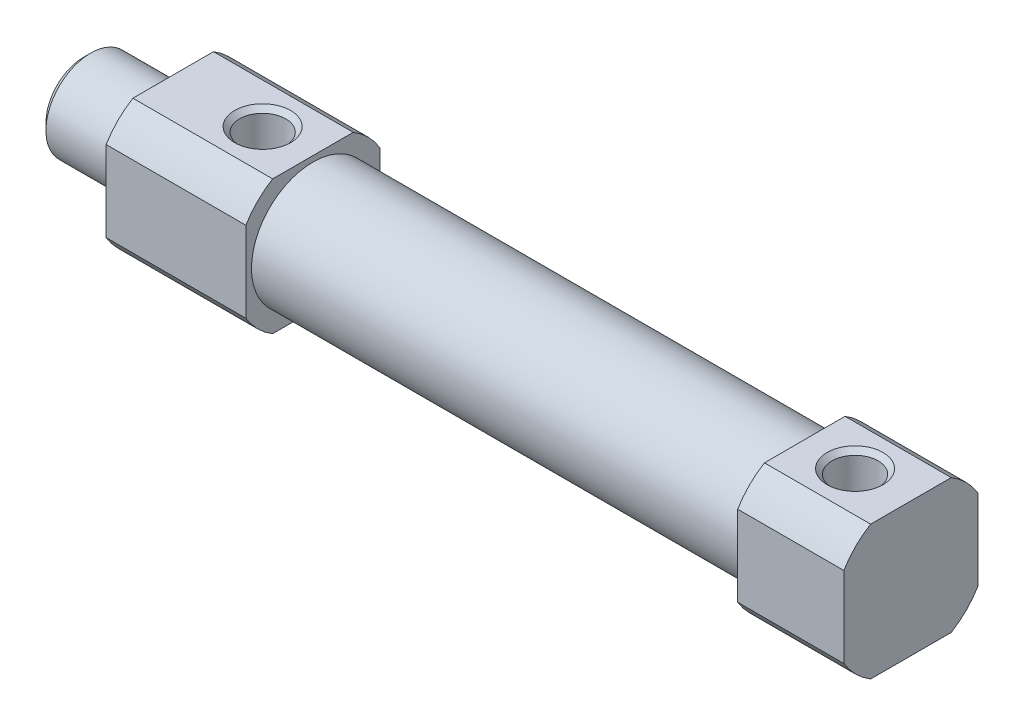
ISO-10303-21;
HEADER;
FILE_DESCRIPTION(('STEP AP214'),'2;1');
FILE_NAME('part.step','',(''),(''),'','','');
FILE_SCHEMA(('AUTOMOTIVE_DESIGN { 1 0 10303 214 1 1 1 1 }'));
ENDSEC;
DATA;
#1=APPLICATION_CONTEXT('core data for automotive mechanical design processes');
#2=APPLICATION_PROTOCOL_DEFINITION('international standard','automotive_design',2000,#1);
#3=PRODUCT_CONTEXT('',#1,'mechanical');
#4=PRODUCT('Part','Part','',(#3));
#5=PRODUCT_RELATED_PRODUCT_CATEGORY('part','',(#4));
#6=PRODUCT_DEFINITION_FORMATION('','',#4);
#7=PRODUCT_DEFINITION_CONTEXT('part definition',#1,'design');
#8=PRODUCT_DEFINITION('design','',#6,#7);
#9=PRODUCT_DEFINITION_SHAPE('','',#8);
#10=(LENGTH_UNIT() NAMED_UNIT(*) SI_UNIT(.MILLI.,.METRE.));
#11=(NAMED_UNIT(*) PLANE_ANGLE_UNIT() SI_UNIT($,.RADIAN.));
#12=(NAMED_UNIT(*) SI_UNIT($,.STERADIAN.) SOLID_ANGLE_UNIT());
#13=UNCERTAINTY_MEASURE_WITH_UNIT(LENGTH_MEASURE(1.E-05),#10,'distance_accuracy_value','');
#14=(GEOMETRIC_REPRESENTATION_CONTEXT(3) GLOBAL_UNCERTAINTY_ASSIGNED_CONTEXT((#13)) GLOBAL_UNIT_ASSIGNED_CONTEXT((#10,
#11,#12)) REPRESENTATION_CONTEXT('',''));
#15=CARTESIAN_POINT('',(0.,0.,0.));
#16=DIRECTION('',(0.,0.,1.));
#17=DIRECTION('',(1.,0.,0.));
#18=AXIS2_PLACEMENT_3D('',#15,#16,#17);
#19=CARTESIAN_POINT('',(8.,6.,0.));
#20=DIRECTION('',(0.,-1.,0.));
#21=DIRECTION('',(0.,0.,1.));
#22=AXIS2_PLACEMENT_3D('',#19,#20,#21);
#23=CYLINDRICAL_SURFACE('',#22,2.067);
#24=CARTESIAN_POINT('',(8.,5.567,0.));
#25=DIRECTION('',(0.,1.,0.));
#26=DIRECTION('',(0.,0.,1.));
#27=AXIS2_PLACEMENT_3D('',#24,#25,#26);
#28=CIRCLE('',#27,2.067);
#29=CARTESIAN_POINT('',(8.,5.567,2.067));
#30=VERTEX_POINT('',#29);
#31=EDGE_CURVE('E247',#30,#30,#28,.T.);
#32=ORIENTED_EDGE('',*,*,#31,.T.);
#33=EDGE_LOOP('',(#32));
#34=FACE_BOUND('',#33,.T.);
#35=CARTESIAN_POINT('',(8.,0.5,0.));
#36=DIRECTION('',(0.,1.,0.));
#37=DIRECTION('',(0.,0.,1.));
#38=AXIS2_PLACEMENT_3D('',#35,#36,#37);
#39=CIRCLE('',#38,2.067);
#40=CARTESIAN_POINT('',(8.7228340058409,0.5,-1.93649167310371));
#41=VERTEX_POINT('',#40);
#42=CARTESIAN_POINT('',(7.2771659941591,0.5,-1.93649167310371));
#43=VERTEX_POINT('',#42);
#44=EDGE_CURVE('E246',#41,#43,#39,.T.);
#45=ORIENTED_EDGE('',*,*,#44,.F.);
#46=CARTESIAN_POINT('',(8.7228340058409,0.5,1.93649167310371));
#47=CARTESIAN_POINT('',(8.74641438669346,0.534015946439016,1.92769864732704));
#48=CARTESIAN_POINT('',(8.77066364385471,0.567342883395501,1.91814791375889));
#49=CARTESIAN_POINT('',(8.82005444410187,0.632835445308381,1.8975528045644));
#50=CARTESIAN_POINT('',(8.84519562088774,0.665001536307264,1.88650903698835));
#51=CARTESIAN_POINT('',(8.92133047181884,0.760137906072527,1.85115392646312));
#52=CARTESIAN_POINT('',(8.97302457510778,0.821731334468729,1.8246227082621));
#53=CARTESIAN_POINT('',(9.07699051726692,0.942526469905346,1.7652790597632));
#54=CARTESIAN_POINT('',(9.1292628873707,1.00169750050937,1.73240552185181));
#55=CARTESIAN_POINT('',(9.23274225869917,1.11705503609938,1.66036439219352));
#56=CARTESIAN_POINT('',(9.28394956599672,1.17324240593131,1.62119863770975));
#57=CARTESIAN_POINT('',(9.37300061379834,1.27000415812177,1.54594420537475));
#58=CARTESIAN_POINT('',(9.41124350632402,1.31123169742145,1.51116882391587));
#59=CARTESIAN_POINT('',(9.48611139402732,1.39149089629071,1.43760898815819));
#60=CARTESIAN_POINT('',(9.52273645076092,1.43052263942221,1.39882468658007));
#61=CARTESIAN_POINT('',(9.62927512494374,1.54359636931833,1.27655390438046));
#62=CARTESIAN_POINT('',(9.69621979492033,1.61401287784804,1.18684800095903));
#63=CARTESIAN_POINT('',(9.80246811368708,1.72528159444406,1.01541633972738));
#64=CARTESIAN_POINT('',(9.84449607743109,1.76912200778013,0.937314133860419));
#65=CARTESIAN_POINT('',(9.91945270072035,1.847140483146,0.772260551749924));
#66=CARTESIAN_POINT('',(9.95238267305496,1.88131993921443,0.685310454687801));
#67=CARTESIAN_POINT('',(10.007069128276,1.9380127992167,0.503259282744631));
#68=CARTESIAN_POINT('',(10.0287151226791,1.96041086268032,0.408087868522303));
#69=CARTESIAN_POINT('',(10.0582963189668,1.99100743013652,0.213437325577024));
#70=CARTESIAN_POINT('',(10.066248072675,1.9992230760263,0.113963546355035));
#71=CARTESIAN_POINT('',(10.0675455565534,2.0005636687613,-0.0701170944974319));
#72=CARTESIAN_POINT('',(10.0629110273649,1.99577537721693,-0.1547062908428));
#73=CARTESIAN_POINT('',(10.0435752982495,1.97578274801866,-0.321451306875911));
#74=CARTESIAN_POINT('',(10.0288735483919,1.96057784134806,-0.403606993375277));
#75=CARTESIAN_POINT('',(9.99087501310422,1.92122876202926,-0.561577101355674));
#76=CARTESIAN_POINT('',(9.96777541614164,1.89728963337458,-0.637491556045158));
#77=CARTESIAN_POINT('',(9.91426683119609,1.84173376999063,-0.783671346792084));
#78=CARTESIAN_POINT('',(9.88385566373221,1.8101147459589,-0.853934990068616));
#79=CARTESIAN_POINT('',(9.80152100698764,1.72429749568737,-1.019340338323));
#80=CARTESIAN_POINT('',(9.74616613620386,1.66643292592594,-1.11088037424613));
#81=CARTESIAN_POINT('',(9.62635147533628,1.5404220715695,-1.27995238682515));
#82=CARTESIAN_POINT('',(9.56186582838299,1.47224654933571,-1.35744310573905));
#83=CARTESIAN_POINT('',(9.40217450637081,1.30186673298192,-1.52451203486714));
#84=CARTESIAN_POINT('',(9.30434117568644,1.19631889983385,-1.60819466234155));
#85=CARTESIAN_POINT('',(9.15439659308825,1.02990219743606,-1.71570727863333));
#86=CARTESIAN_POINT('',(9.10388139766241,0.973079359869926,-1.74854349546478));
#87=CARTESIAN_POINT('',(9.00270525296404,0.856606760726646,-1.80845646199698));
#88=CARTESIAN_POINT('',(8.9520444063416,0.796958673709608,-1.83553657244434));
#89=CARTESIAN_POINT('',(8.87119067120393,0.697833563230635,-1.87475010954378));
#90=CARTESIAN_POINT('',(8.84058732683454,0.659377098882475,-1.88863658871653));
#91=CARTESIAN_POINT('',(8.78062663814254,0.580936928190525,-1.91420724305179));
#92=CARTESIAN_POINT('',(8.75126684973025,0.54095654199685,-1.92589590982073));
#93=CARTESIAN_POINT('',(8.7228340058409,0.500000000000001,-1.93649167310371));
#94=B_SPLINE_CURVE_WITH_KNOTS('',3,(#46,#47,#48,#49,#50,#51,#52,#53,#54,#55,#56,#57,#58,#59,#60,
#61,#62,#63,#64,#65,#66,#67,#68,#69,#70,#71,#72,#73,#74,#75,#76,#77,#78,#79,#80,#81,#82,#83,#84,
#85,#86,#87,#88,#89,#90,#91,#92,#93),.UNSPECIFIED.,.F.,.F.,(4,2,2,2,2,2,2,2,2,2,2,2,2,2,2,2,2,2,
2,2,2,2,2,4),(0.,0.126886662620257,0.253721804412297,0.50744860829703,0.763754566782337,
1.01998582210413,1.21816387660203,1.41633438424443,1.8108370863841,2.10658615336432,
2.40229252309111,2.70084238668585,2.99903114797452,3.25230237318273,3.50558743465593,
3.7532733154639,4.00103311984414,4.36386157394748,4.72773884935274,5.22429885238841,
5.47259063968532,5.72073705929309,5.87387882412701,6.02670413247603),.UNSPECIFIED.);
#95=CARTESIAN_POINT('',(8.7228340058409,0.5,1.93649167310371));
#96=VERTEX_POINT('',#95);
#97=EDGE_CURVE('E224',#96,#41,#94,.T.);
#98=ORIENTED_EDGE('',*,*,#97,.F.);
#99=CARTESIAN_POINT('',(7.2771659941591,0.500000000000001,1.93649167310371));
#100=VERTEX_POINT('',#99);
#101=EDGE_CURVE('E244',#100,#96,#39,.T.);
#102=ORIENTED_EDGE('',*,*,#101,.F.);
#103=CARTESIAN_POINT('',(7.2771659941591,0.5,-1.93649167310371));
#104=CARTESIAN_POINT('',(7.25358561330654,0.534015946439015,-1.92769864732704));
#105=CARTESIAN_POINT('',(7.2293363561453,0.5673428833955,-1.91814791375889));
#106=CARTESIAN_POINT('',(7.17994555589813,0.63283544530838,-1.89755280456441));
#107=CARTESIAN_POINT('',(7.15480437911226,0.665001536307263,-1.88650903698835));
#108=CARTESIAN_POINT('',(7.07866952818116,0.760137906072526,-1.85115392646312));
#109=CARTESIAN_POINT('',(7.02697542489222,0.821731334468729,-1.8246227082621));
#110=CARTESIAN_POINT('',(6.92300948273308,0.942526469905346,-1.7652790597632));
#111=CARTESIAN_POINT('',(6.8707371126293,1.00169750050937,-1.73240552185182));
#112=CARTESIAN_POINT('',(6.76725774130083,1.11705503609938,-1.66036439219352));
#113=CARTESIAN_POINT('',(6.71605043400328,1.17324240593131,-1.62119863770975));
#114=CARTESIAN_POINT('',(6.62699938620166,1.27000415812177,-1.54594420537475));
#115=CARTESIAN_POINT('',(6.58875649367598,1.31123169742145,-1.51116882391587));
#116=CARTESIAN_POINT('',(6.51388860597268,1.39149089629071,-1.43760898815819));
#117=CARTESIAN_POINT('',(6.47726354923908,1.43052263942221,-1.39882468658007));
#118=CARTESIAN_POINT('',(6.37072487505626,1.54359636931833,-1.27655390438046));
#119=CARTESIAN_POINT('',(6.30378020507967,1.61401287784804,-1.18684800095903));
#120=CARTESIAN_POINT('',(6.19753188631292,1.72528159444406,-1.01541633972738));
#121=CARTESIAN_POINT('',(6.15550392256891,1.76912200778013,-0.937314133860419));
#122=CARTESIAN_POINT('',(6.08054729927965,1.847140483146,-0.772260551749924));
#123=CARTESIAN_POINT('',(6.04761732694504,1.88131993921443,-0.685310454687801));
#124=CARTESIAN_POINT('',(5.99293087172402,1.9380127992167,-0.503259282744631));
#125=CARTESIAN_POINT('',(5.97128487732094,1.96041086268032,-0.408087868522303));
#126=CARTESIAN_POINT('',(5.94170368103322,1.99100743013652,-0.213437325577024));
#127=CARTESIAN_POINT('',(5.93375192732501,1.9992230760263,-0.113963546355034));
#128=CARTESIAN_POINT('',(5.93245444344663,2.0005636687613,0.0701170944974332));
#129=CARTESIAN_POINT('',(5.93708897263512,1.99577537721694,0.154706290842801));
#130=CARTESIAN_POINT('',(5.95642470175051,1.97578274801866,0.321451306875912));
#131=CARTESIAN_POINT('',(5.97112645160811,1.96057784134806,0.403606993375278));
#132=CARTESIAN_POINT('',(6.00912498689579,1.92122876202926,0.561577101355675));
#133=CARTESIAN_POINT('',(6.03222458385836,1.89728963337458,0.637491556045159));
#134=CARTESIAN_POINT('',(6.08573316880391,1.84173376999063,0.783671346792085));
#135=CARTESIAN_POINT('',(6.11614433626778,1.8101147459589,0.853934990068617));
#136=CARTESIAN_POINT('',(6.19847899301236,1.72429749568737,1.019340338323));
#137=CARTESIAN_POINT('',(6.25383386379614,1.66643292592594,1.11088037424613));
#138=CARTESIAN_POINT('',(6.37364852466372,1.5404220715695,1.27995238682515));
#139=CARTESIAN_POINT('',(6.43813417161701,1.47224654933571,1.35744310573905));
#140=CARTESIAN_POINT('',(6.59782549362919,1.30186673298192,1.52451203486714));
#141=CARTESIAN_POINT('',(6.69565882431356,1.19631889983385,1.60819466234155));
#142=CARTESIAN_POINT('',(6.84560340691175,1.02990219743606,1.71570727863333));
#143=CARTESIAN_POINT('',(6.89611860233759,0.973079359869925,1.74854349546478));
#144=CARTESIAN_POINT('',(6.99729474703596,0.856606760726645,1.80845646199698));
#145=CARTESIAN_POINT('',(7.0479555936584,0.796958673709609,1.83553657244434));
#146=CARTESIAN_POINT('',(7.12880932879607,0.697833563230635,1.87475010954378));
#147=CARTESIAN_POINT('',(7.15941267316546,0.659377098882475,1.88863658871653));
#148=CARTESIAN_POINT('',(7.21937336185746,0.580936928190524,1.91420724305179));
#149=CARTESIAN_POINT('',(7.24873315026975,0.540956541996849,1.92589590982073));
#150=CARTESIAN_POINT('',(7.2771659941591,0.500000000000001,1.93649167310371));
#151=B_SPLINE_CURVE_WITH_KNOTS('',3,(#103,#104,#105,#106,#107,#108,#109,#110,#111,#112,#113,
#114,#115,#116,#117,#118,#119,#120,#121,#122,#123,#124,#125,#126,#127,#128,#129,#130,#131,#132,
#133,#134,#135,#136,#137,#138,#139,#140,#141,#142,#143,#144,#145,#146,#147,#148,#149,#150),
.UNSPECIFIED.,.F.,.F.,(4,2,2,2,2,2,2,2,2,2,2,2,2,2,2,2,2,2,2,2,2,2,2,4),(0.,0.126886662620256,
0.253721804412296,0.507448608297029,0.763754566782338,1.01998582210413,1.21816387660203,
1.41633438424443,1.8108370863841,2.10658615336432,2.40229252309111,2.70084238668585,
2.99903114797452,3.25230237318273,3.50558743465594,3.7532733154639,4.00103311984414,
4.36386157394748,4.72773884935274,5.22429885238841,5.47259063968532,5.72073705929309,
5.87387882412701,6.02670413247603),.UNSPECIFIED.);
#152=EDGE_CURVE('E230',#43,#100,#151,.T.);
#153=ORIENTED_EDGE('',*,*,#152,.F.);
#154=EDGE_LOOP('',(#45,#98,#102,#153));
#155=FACE_BOUND('',#154,.T.);
#156=ADVANCED_FACE('F41',(#34,#155),#23,.F.);
#157=CARTESIAN_POINT('',(8.,0.5,0.));
#158=DIRECTION('',(0.,1.,0.));
#159=DIRECTION('',(0.,0.,-1.));
#160=AXIS2_PLACEMENT_3D('',#157,#158,#159);
#161=CONICAL_SURFACE('',#160,2.067,1.0471975511966);
#162=ORIENTED_EDGE('',*,*,#44,.T.);
#163=CARTESIAN_POINT('',(9.24704241368537,0.619538300641497,-1.90162359420529));
#164=CARTESIAN_POINT('',(9.1229247075013,0.585577610865678,-1.91268265466528));
#165=CARTESIAN_POINT('',(8.99756248643156,0.554821201104464,-1.92169201637551));
#166=CARTESIAN_POINT('',(8.74445887332115,0.502262996770411,-1.93610179290636));
#167=CARTESIAN_POINT('',(8.61671217144973,0.480484541566679,-1.94149282394494));
#168=CARTESIAN_POINT('',(8.3631103855628,0.449066378855434,-1.94900005347991));
#169=CARTESIAN_POINT('',(8.23729908516125,0.439111049117393,-1.95120176378268));
#170=CARTESIAN_POINT('',(7.9854527873799,0.431787902042918,-1.95283909097587));
#171=CARTESIAN_POINT('',(7.85941838765312,0.434401667114269,-1.95227875508386));
#172=CARTESIAN_POINT('',(7.65152971872454,0.448741725634538,-1.94901329499722));
#173=CARTESIAN_POINT('',(7.5694009342667,0.457021688340908,-1.9471128235577));
#174=CARTESIAN_POINT('',(7.40574290856366,0.478251250868833,-1.94200848228045));
#175=CARTESIAN_POINT('',(7.32421405052357,0.491203608818529,-1.93880384244494));
#176=CARTESIAN_POINT('',(7.16046360825313,0.521394482936852,-1.93090481591668));
#177=CARTESIAN_POINT('',(7.07825752374738,0.538708530328618,-1.92618372424274));
#178=CARTESIAN_POINT('',(6.91486222357032,0.576746379129997,-1.91513900885633));
#179=CARTESIAN_POINT('',(6.8336717631633,0.597465450813619,-1.90881760156029));
#180=CARTESIAN_POINT('',(6.75295758631464,0.619538300641506,-1.90162359420531));
#181=B_SPLINE_CURVE_WITH_KNOTS('',3,(#163,#164,#165,#166,#167,#168,#169,#170,#171,#172,#173,
#174,#175,#176,#177,#178,#179,#180),.UNSPECIFIED.,.F.,.F.,(4,2,2,2,2,2,2,2,4),(0.,
0.387678442983826,0.776358446332346,1.15441095381005,1.53190966695773,1.77946861072623,
2.02717392901579,2.27950543246196,2.53148935390974),.UNSPECIFIED.);
#182=EDGE_CURVE('E11',#41,#43,#181,.T.);
#183=ORIENTED_EDGE('',*,*,#182,.F.);
#184=EDGE_LOOP('',(#162,#183));
#185=FACE_BOUND('',#184,.T.);
#186=ADVANCED_FACE('F206',(#185),#161,.F.);
#187=ORIENTED_EDGE('',*,*,#101,.T.);
#188=CARTESIAN_POINT('',(6.75295758631463,0.619538300641497,1.90162359420529));
#189=CARTESIAN_POINT('',(6.8770752924987,0.585577610865677,1.91268265466528));
#190=CARTESIAN_POINT('',(7.00243751356845,0.554821201104463,1.92169201637551));
#191=CARTESIAN_POINT('',(7.25554112667885,0.50226299677041,1.93610179290636));
#192=CARTESIAN_POINT('',(7.38328782855027,0.480484541566679,1.94149282394494));
#193=CARTESIAN_POINT('',(7.6368896144372,0.449066378855434,1.94900005347991));
#194=CARTESIAN_POINT('',(7.76270091483874,0.439111049117393,1.95120176378268));
#195=CARTESIAN_POINT('',(8.0145472126201,0.431787902042918,1.95283909097587));
#196=CARTESIAN_POINT('',(8.14058161234688,0.434401667114269,1.95227875508386));
#197=CARTESIAN_POINT('',(8.34847028127546,0.448741725634538,1.94901329499722));
#198=CARTESIAN_POINT('',(8.4305990657333,0.457021688340908,1.9471128235577));
#199=CARTESIAN_POINT('',(8.59425709143634,0.478251250868833,1.94200848228045));
#200=CARTESIAN_POINT('',(8.67578594947643,0.491203608818529,1.93880384244494));
#201=CARTESIAN_POINT('',(8.83953639174687,0.521394482936852,1.93090481591668));
#202=CARTESIAN_POINT('',(8.92174247625262,0.538708530328618,1.92618372424274));
#203=CARTESIAN_POINT('',(9.08513777642968,0.576746379129998,1.91513900885633));
#204=CARTESIAN_POINT('',(9.1663282368367,0.59746545081362,1.90881760156029));
#205=CARTESIAN_POINT('',(9.24704241368537,0.619538300641506,1.90162359420531));
#206=B_SPLINE_CURVE_WITH_KNOTS('',3,(#188,#189,#190,#191,#192,#193,#194,#195,#196,#197,#198,
#199,#200,#201,#202,#203,#204,#205),.UNSPECIFIED.,.F.,.F.,(4,2,2,2,2,2,2,2,4),(0.,
0.387678442983827,0.776358446332345,1.15441095381004,1.53190966695772,1.77946861072623,
2.02717392901578,2.27950543246196,2.53148935390974),.UNSPECIFIED.);
#207=EDGE_CURVE('E54',#100,#96,#206,.T.);
#208=ORIENTED_EDGE('',*,*,#207,.F.);
#209=EDGE_LOOP('',(#187,#208));
#210=FACE_BOUND('',#209,.T.);
#211=ADVANCED_FACE('F211',(#210),#161,.F.);
#212=CARTESIAN_POINT('',(-8.,0.,0.));
#213=DIRECTION('',(1.,0.,0.));
#214=DIRECTION('',(0.,0.,1.));
#215=AXIS2_PLACEMENT_3D('',#212,#213,#214);
#216=PLANE('',#215);
#217=CARTESIAN_POINT('',(-8.,0.,0.));
#218=DIRECTION('',(1.,0.,0.));
#219=DIRECTION('',(0.,0.,-1.));
#220=AXIS2_PLACEMENT_3D('',#217,#218,#219);
#221=CIRCLE('',#220,2.);
#222=CARTESIAN_POINT('',(-8.,0.,-2.));
#223=VERTEX_POINT('',#222);
#224=EDGE_CURVE('E511',#223,#223,#221,.T.);
#225=ORIENTED_EDGE('',*,*,#224,.T.);
#226=EDGE_LOOP('',(#225));
#227=FACE_BOUND('',#226,.T.);
#228=CARTESIAN_POINT('',(-8.,0.,0.));
#229=DIRECTION('',(1.,0.,0.));
#230=DIRECTION('',(0.,0.,-1.));
#231=AXIS2_PLACEMENT_3D('',#228,#229,#230);
#232=CIRCLE('',#231,3.3865);
#233=CARTESIAN_POINT('',(-8.,0.,-3.3865));
#234=VERTEX_POINT('',#233);
#235=EDGE_CURVE('E196',#234,#234,#232,.T.);
#236=ORIENTED_EDGE('',*,*,#235,.F.);
#237=EDGE_LOOP('',(#236));
#238=FACE_BOUND('',#237,.T.);
#239=ADVANCED_FACE('F43',(#227,#238),#216,.F.);
#240=CARTESIAN_POINT('',(-7.3865,0.,0.));
#241=DIRECTION('',(1.,0.,0.));
#242=DIRECTION('',(0.,0.,1.));
#243=AXIS2_PLACEMENT_3D('',#240,#241,#242);
#244=CONICAL_SURFACE('',#243,4.,0.785398163397448);
#245=ORIENTED_EDGE('',*,*,#235,.T.);
#246=EDGE_LOOP('',(#245));
#247=FACE_BOUND('',#246,.T.);
#248=CARTESIAN_POINT('',(-7.3865,0.,0.));
#249=DIRECTION('',(1.,0.,0.));
#250=DIRECTION('',(0.,0.,-1.));
#251=AXIS2_PLACEMENT_3D('',#248,#249,#250);
#252=CIRCLE('',#251,4.);
#253=CARTESIAN_POINT('',(-7.3865,0.,-4.));
#254=VERTEX_POINT('',#253);
#255=EDGE_CURVE('E193',#254,#254,#252,.T.);
#256=ORIENTED_EDGE('',*,*,#255,.F.);
#257=EDGE_LOOP('',(#256));
#258=FACE_BOUND('',#257,.T.);
#259=ADVANCED_FACE('F379',(#247,#258),#244,.T.);
#260=CARTESIAN_POINT('',(0.,0.,0.));
#261=DIRECTION('',(-1.,0.,0.));
#262=DIRECTION('',(0.,0.,-1.));
#263=AXIS2_PLACEMENT_3D('',#260,#261,#262);
#264=CYLINDRICAL_SURFACE('',#263,4.);
#265=ORIENTED_EDGE('',*,*,#255,.T.);
#266=EDGE_LOOP('',(#265));
#267=FACE_BOUND('',#266,.T.);
#268=CARTESIAN_POINT('',(0.,0.,0.));
#269=DIRECTION('',(1.,0.,0.));
#270=DIRECTION('',(0.,0.,-1.));
#271=AXIS2_PLACEMENT_3D('',#268,#269,#270);
#272=CIRCLE('',#271,4.);
#273=CARTESIAN_POINT('',(0.,0.,-4.));
#274=VERTEX_POINT('',#273);
#275=EDGE_CURVE('E190',#274,#274,#272,.T.);
#276=ORIENTED_EDGE('',*,*,#275,.F.);
#277=EDGE_LOOP('',(#276));
#278=FACE_BOUND('',#277,.T.);
#279=ADVANCED_FACE('F377',(#267,#278),#264,.T.);
#280=CARTESIAN_POINT('',(12.5,1.2195106036117E-12,1.2195106036117E-12));
#281=DIRECTION('',(-1.,0.,0.));
#282=DIRECTION('',(0.,0.,-1.));
#283=AXIS2_PLACEMENT_3D('',#280,#281,#282);
#284=CYLINDRICAL_SURFACE('',#283,7.00000000000001);
#285=CARTESIAN_POINT('',(0.,1.2195106036117E-12,1.2195106036117E-12));
#286=DIRECTION('',(-1.,0.,0.));
#287=DIRECTION('',(0.,0.,1.));
#288=AXIS2_PLACEMENT_3D('',#285,#286,#287);
#289=CIRCLE('',#288,7.00000000000001);
#290=CARTESIAN_POINT('',(0.,6.,-3.605551275464));
#291=VERTEX_POINT('',#290);
#292=CARTESIAN_POINT('',(0.,3.605551275464,-6.));
#293=VERTEX_POINT('',#292);
#294=EDGE_CURVE('E155',#291,#293,#289,.T.);
#295=ORIENTED_EDGE('',*,*,#294,.F.);
#296=DIRECTION('',(-1.,0.,0.));
#297=VECTOR('',#296,1.);
#298=CARTESIAN_POINT('',(12.5,6.,-3.605551275464));
#299=LINE('',#298,#297);
#300=CARTESIAN_POINT('',(12.5,6.,-3.605551275464));
#301=VERTEX_POINT('',#300);
#302=EDGE_CURVE('E154',#301,#291,#299,.T.);
#303=ORIENTED_EDGE('',*,*,#302,.F.);
#304=CARTESIAN_POINT('',(12.5,1.2195106036117E-12,1.2195106036117E-12));
#305=DIRECTION('',(-1.,0.,0.));
#306=DIRECTION('',(0.,0.,1.));
#307=AXIS2_PLACEMENT_3D('',#304,#305,#306);
#308=CIRCLE('',#307,7.00000000000001);
#309=CARTESIAN_POINT('',(12.5,3.605551275464,-6.));
#310=VERTEX_POINT('',#309);
#311=EDGE_CURVE('E174',#301,#310,#308,.T.);
#312=ORIENTED_EDGE('',*,*,#311,.T.);
#313=DIRECTION('',(-1.,0.,0.));
#314=VECTOR('',#313,1.);
#315=CARTESIAN_POINT('',(12.5,3.605551275464,-6.));
#316=LINE('',#315,#314);
#317=EDGE_CURVE('E187',#310,#293,#316,.T.);
#318=ORIENTED_EDGE('',*,*,#317,.T.);
#319=EDGE_LOOP('',(#295,#303,#312,#318));
#320=FACE_BOUND('',#319,.T.);
#321=ADVANCED_FACE('F350',(#320),#284,.T.);
#322=CARTESIAN_POINT('',(12.5,3.605551275464,-6.));
#323=DIRECTION('',(0.,0.,1.));
#324=DIRECTION('',(-1.,0.,0.));
#325=AXIS2_PLACEMENT_3D('',#322,#323,#324);
#326=PLANE('',#325);
#327=DIRECTION('',(0.,-1.,0.));
#328=VECTOR('',#327,1.);
#329=CARTESIAN_POINT('',(0.,3.605551275464,-6.));
#330=LINE('',#329,#328);
#331=CARTESIAN_POINT('',(0.,-3.605551275464,-6.));
#332=VERTEX_POINT('',#331);
#333=EDGE_CURVE('E157',#293,#332,#330,.T.);
#334=ORIENTED_EDGE('',*,*,#333,.F.);
#335=ORIENTED_EDGE('',*,*,#317,.F.);
#336=DIRECTION('',(0.,-1.,0.));
#337=VECTOR('',#336,1.);
#338=CARTESIAN_POINT('',(12.5,3.605551275464,-6.));
#339=LINE('',#338,#337);
#340=CARTESIAN_POINT('',(12.5,-3.605551275464,-6.));
#341=VERTEX_POINT('',#340);
#342=EDGE_CURVE('E109',#310,#341,#339,.T.);
#343=ORIENTED_EDGE('',*,*,#342,.T.);
#344=DIRECTION('',(-1.,0.,0.));
#345=VECTOR('',#344,1.);
#346=CARTESIAN_POINT('',(12.5,-3.605551275464,-6.));
#347=LINE('',#346,#345);
#348=EDGE_CURVE('E184',#341,#332,#347,.T.);
#349=ORIENTED_EDGE('',*,*,#348,.T.);
#350=EDGE_LOOP('',(#334,#335,#343,#349));
#351=FACE_BOUND('',#350,.T.);
#352=ADVANCED_FACE('F346',(#351),#326,.F.);
#353=CARTESIAN_POINT('',(12.5,1.2195106036117E-12,1.2195106036117E-12));
#354=DIRECTION('',(-1.,0.,0.));
#355=DIRECTION('',(0.,0.,-1.));
#356=AXIS2_PLACEMENT_3D('',#353,#354,#355);
#357=CYLINDRICAL_SURFACE('',#356,7.00000000000168);
#358=CARTESIAN_POINT('',(0.,1.2195106036117E-12,1.2195106036117E-12));
#359=DIRECTION('',(-1.,0.,0.));
#360=DIRECTION('',(0.,0.,1.));
#361=AXIS2_PLACEMENT_3D('',#358,#359,#360);
#362=CIRCLE('',#361,7.00000000000168);
#363=CARTESIAN_POINT('',(0.,-6.,-3.605551275464));
#364=VERTEX_POINT('',#363);
#365=EDGE_CURVE('E161',#332,#364,#362,.T.);
#366=ORIENTED_EDGE('',*,*,#365,.F.);
#367=ORIENTED_EDGE('',*,*,#348,.F.);
#368=CARTESIAN_POINT('',(12.5,1.2195106036117E-12,1.2195106036117E-12));
#369=DIRECTION('',(-1.,0.,0.));
#370=DIRECTION('',(0.,0.,1.));
#371=AXIS2_PLACEMENT_3D('',#368,#369,#370);
#372=CIRCLE('',#371,7.00000000000168);
#373=CARTESIAN_POINT('',(12.5,-6.,-3.605551275464));
#374=VERTEX_POINT('',#373);
#375=EDGE_CURVE('E332',#341,#374,#372,.T.);
#376=ORIENTED_EDGE('',*,*,#375,.T.);
#377=DIRECTION('',(-1.,0.,0.));
#378=VECTOR('',#377,1.);
#379=CARTESIAN_POINT('',(12.5,-6.,-3.605551275464));
#380=LINE('',#379,#378);
#381=EDGE_CURVE('E181',#374,#364,#380,.T.);
#382=ORIENTED_EDGE('',*,*,#381,.T.);
#383=EDGE_LOOP('',(#366,#367,#376,#382));
#384=FACE_BOUND('',#383,.T.);
#385=ADVANCED_FACE('F344',(#384),#357,.T.);
#386=CARTESIAN_POINT('',(12.5,-6.,-3.605551275464));
#387=DIRECTION('',(0.,1.,0.));
#388=DIRECTION('',(0.,0.,-1.));
#389=AXIS2_PLACEMENT_3D('',#386,#387,#388);
#390=PLANE('',#389);
#391=DIRECTION('',(0.,0.,1.));
#392=VECTOR('',#391,1.);
#393=CARTESIAN_POINT('',(0.,-6.,-3.605551275464));
#394=LINE('',#393,#392);
#395=CARTESIAN_POINT('',(0.,-6.,3.605551275464));
#396=VERTEX_POINT('',#395);
#397=EDGE_CURVE('E164',#364,#396,#394,.T.);
#398=ORIENTED_EDGE('',*,*,#397,.F.);
#399=ORIENTED_EDGE('',*,*,#381,.F.);
#400=DIRECTION('',(0.,0.,1.));
#401=VECTOR('',#400,1.);
#402=CARTESIAN_POINT('',(12.5,-6.,-3.605551275464));
#403=LINE('',#402,#401);
#404=CARTESIAN_POINT('',(12.5,-6.,3.605551275464));
#405=VERTEX_POINT('',#404);
#406=EDGE_CURVE('E149',#374,#405,#403,.T.);
#407=ORIENTED_EDGE('',*,*,#406,.T.);
#408=DIRECTION('',(-1.,0.,0.));
#409=VECTOR('',#408,1.);
#410=CARTESIAN_POINT('',(12.5,-6.,3.605551275464));
#411=LINE('',#410,#409);
#412=EDGE_CURVE('E178',#405,#396,#411,.T.);
#413=ORIENTED_EDGE('',*,*,#412,.T.);
#414=EDGE_LOOP('',(#398,#399,#407,#413));
#415=FACE_BOUND('',#414,.T.);
#416=ADVANCED_FACE('F337',(#415),#390,.F.);
#417=CARTESIAN_POINT('',(12.5,1.2195106036117E-12,1.2195106036117E-12));
#418=DIRECTION('',(-1.,0.,0.));
#419=DIRECTION('',(0.,0.,-1.));
#420=AXIS2_PLACEMENT_3D('',#417,#418,#419);
#421=CYLINDRICAL_SURFACE('',#420,7.00000000000001);
#422=CARTESIAN_POINT('',(0.,1.2195106036117E-12,1.2195106036117E-12));
#423=DIRECTION('',(-1.,0.,0.));
#424=DIRECTION('',(0.,0.,1.));
#425=AXIS2_PLACEMENT_3D('',#422,#423,#424);
#426=CIRCLE('',#425,7.00000000000001);
#427=CARTESIAN_POINT('',(0.,-3.60555127546422,6.00000000000036));
#428=VERTEX_POINT('',#427);
#429=EDGE_CURVE('E167',#396,#428,#426,.T.);
#430=ORIENTED_EDGE('',*,*,#429,.F.);
#431=ORIENTED_EDGE('',*,*,#412,.F.);
#432=CARTESIAN_POINT('',(12.5,1.2195106036117E-12,1.2195106036117E-12));
#433=DIRECTION('',(-1.,0.,0.));
#434=DIRECTION('',(0.,0.,1.));
#435=AXIS2_PLACEMENT_3D('',#432,#433,#434);
#436=CIRCLE('',#435,7.00000000000001);
#437=CARTESIAN_POINT('',(12.5,-3.60555127546422,6.00000000000036));
#438=VERTEX_POINT('',#437);
#439=EDGE_CURVE('E147',#405,#438,#436,.T.);
#440=ORIENTED_EDGE('',*,*,#439,.T.);
#441=DIRECTION('',(-1.,0.,0.));
#442=VECTOR('',#441,1.);
#443=CARTESIAN_POINT('',(12.5,-3.60555127546422,6.00000000000036));
#444=LINE('',#443,#442);
#445=EDGE_CURVE('E141',#438,#428,#444,.T.);
#446=ORIENTED_EDGE('',*,*,#445,.T.);
#447=EDGE_LOOP('',(#430,#431,#440,#446));
#448=FACE_BOUND('',#447,.T.);
#449=ADVANCED_FACE('F341',(#448),#421,.T.);
#450=CARTESIAN_POINT('',(12.5,-3.605551275464,6.));
#451=DIRECTION('',(0.,0.,-1.));
#452=DIRECTION('',(1.,0.,0.));
#453=AXIS2_PLACEMENT_3D('',#450,#451,#452);
#454=PLANE('',#453);
#455=DIRECTION('',(0.,1.,0.));
#456=VECTOR('',#455,1.);
#457=CARTESIAN_POINT('',(0.,-3.605551275464,6.));
#458=LINE('',#457,#456);
#459=CARTESIAN_POINT('',(0.,3.605551275464,6.));
#460=VERTEX_POINT('',#459);
#461=EDGE_CURVE('E170',#428,#460,#458,.T.);
#462=ORIENTED_EDGE('',*,*,#461,.F.);
#463=ORIENTED_EDGE('',*,*,#445,.F.);
#464=DIRECTION('',(0.,1.,0.));
#465=VECTOR('',#464,1.);
#466=CARTESIAN_POINT('',(12.5,-3.605551275464,6.));
#467=LINE('',#466,#465);
#468=CARTESIAN_POINT('',(12.5,3.605551275464,6.));
#469=VERTEX_POINT('',#468);
#470=EDGE_CURVE('E130',#438,#469,#467,.T.);
#471=ORIENTED_EDGE('',*,*,#470,.T.);
#472=DIRECTION('',(-1.,0.,0.));
#473=VECTOR('',#472,1.);
#474=CARTESIAN_POINT('',(12.5,3.605551275464,6.));
#475=LINE('',#474,#473);
#476=EDGE_CURVE('E136',#469,#460,#475,.T.);
#477=ORIENTED_EDGE('',*,*,#476,.T.);
#478=EDGE_LOOP('',(#462,#463,#471,#477));
#479=FACE_BOUND('',#478,.T.);
#480=ADVANCED_FACE('F144',(#479),#454,.F.);
#481=CARTESIAN_POINT('',(12.5,1.2195106036117E-12,1.2195106036117E-12));
#482=DIRECTION('',(-1.,0.,0.));
#483=DIRECTION('',(0.,0.,-1.));
#484=AXIS2_PLACEMENT_3D('',#481,#482,#483);
#485=CYLINDRICAL_SURFACE('',#484,6.99999999999833);
#486=CARTESIAN_POINT('',(0.,1.2195106036117E-12,1.2195106036117E-12));
#487=DIRECTION('',(-1.,0.,0.));
#488=DIRECTION('',(0.,0.,1.));
#489=AXIS2_PLACEMENT_3D('',#486,#487,#488);
#490=CIRCLE('',#489,6.99999999999833);
#491=CARTESIAN_POINT('',(0.,6.,3.605551275464));
#492=VERTEX_POINT('',#491);
#493=EDGE_CURVE('E138',#460,#492,#490,.T.);
#494=ORIENTED_EDGE('',*,*,#493,.F.);
#495=ORIENTED_EDGE('',*,*,#476,.F.);
#496=CARTESIAN_POINT('',(12.5,1.2195106036117E-12,1.2195106036117E-12));
#497=DIRECTION('',(-1.,0.,0.));
#498=DIRECTION('',(0.,0.,1.));
#499=AXIS2_PLACEMENT_3D('',#496,#497,#498);
#500=CIRCLE('',#499,6.99999999999833);
#501=CARTESIAN_POINT('',(12.5,6.,3.605551275464));
#502=VERTEX_POINT('',#501);
#503=EDGE_CURVE('E126',#469,#502,#500,.T.);
#504=ORIENTED_EDGE('',*,*,#503,.T.);
#505=DIRECTION('',(-1.,0.,0.));
#506=VECTOR('',#505,1.);
#507=CARTESIAN_POINT('',(12.5,6.,3.605551275464));
#508=LINE('',#507,#506);
#509=EDGE_CURVE('E142',#502,#492,#508,.T.);
#510=ORIENTED_EDGE('',*,*,#509,.T.);
#511=EDGE_LOOP('',(#494,#495,#504,#510));
#512=FACE_BOUND('',#511,.T.);
#513=ADVANCED_FACE('F137',(#512),#485,.T.);
#514=CARTESIAN_POINT('',(12.5,6.,3.605551275464));
#515=DIRECTION('',(0.,-1.,0.));
#516=DIRECTION('',(0.,0.,1.));
#517=AXIS2_PLACEMENT_3D('',#514,#515,#516);
#518=PLANE('',#517);
#519=CARTESIAN_POINT('',(8.,6.,0.));
#520=DIRECTION('',(0.,1.,0.));
#521=DIRECTION('',(0.,0.,1.));
#522=AXIS2_PLACEMENT_3D('',#519,#520,#521);
#523=CIRCLE('',#522,2.5);
#524=CARTESIAN_POINT('',(8.,6.,2.5));
#525=VERTEX_POINT('',#524);
#526=EDGE_CURVE('E250',#525,#525,#523,.T.);
#527=ORIENTED_EDGE('',*,*,#526,.F.);
#528=EDGE_LOOP('',(#527));
#529=FACE_BOUND('',#528,.T.);
#530=DIRECTION('',(0.,0.,-1.));
#531=VECTOR('',#530,1.);
#532=CARTESIAN_POINT('',(0.,6.,3.605551275464));
#533=LINE('',#532,#531);
#534=EDGE_CURVE('E102',#492,#291,#533,.T.);
#535=ORIENTED_EDGE('',*,*,#534,.F.);
#536=ORIENTED_EDGE('',*,*,#509,.F.);
#537=DIRECTION('',(0.,0.,-1.));
#538=VECTOR('',#537,1.);
#539=CARTESIAN_POINT('',(12.5,6.,3.605551275464));
#540=LINE('',#539,#538);
#541=EDGE_CURVE('E69',#502,#301,#540,.T.);
#542=ORIENTED_EDGE('',*,*,#541,.T.);
#543=ORIENTED_EDGE('',*,*,#302,.T.);
#544=EDGE_LOOP('',(#535,#536,#542,#543));
#545=FACE_BOUND('',#544,.T.);
#546=ADVANCED_FACE('F351',(#529,#545),#518,.F.);
#547=CARTESIAN_POINT('',(12.5,1.2195106036117E-12,1.2195106036117E-12));
#548=DIRECTION('',(1.,0.,0.));
#549=DIRECTION('',(0.,0.,1.));
#550=AXIS2_PLACEMENT_3D('',#547,#548,#549);
#551=PLANE('',#550);
#552=CARTESIAN_POINT('',(12.5,0.,0.));
#553=DIRECTION('',(-1.,0.,0.));
#554=DIRECTION('',(0.,0.,1.));
#555=AXIS2_PLACEMENT_3D('',#552,#553,#554);
#556=CIRCLE('',#555,5.5);
#557=CARTESIAN_POINT('',(12.5,0.,5.5));
#558=VERTEX_POINT('',#557);
#559=EDGE_CURVE('E198',#558,#558,#556,.T.);
#560=ORIENTED_EDGE('',*,*,#559,.T.);
#561=EDGE_LOOP('',(#560));
#562=FACE_BOUND('',#561,.T.);
#563=ORIENTED_EDGE('',*,*,#311,.F.);
#564=ORIENTED_EDGE('',*,*,#541,.F.);
#565=ORIENTED_EDGE('',*,*,#503,.F.);
#566=ORIENTED_EDGE('',*,*,#470,.F.);
#567=ORIENTED_EDGE('',*,*,#439,.F.);
#568=ORIENTED_EDGE('',*,*,#406,.F.);
#569=ORIENTED_EDGE('',*,*,#375,.F.);
#570=ORIENTED_EDGE('',*,*,#342,.F.);
#571=EDGE_LOOP('',(#563,#564,#565,#566,#567,#568,#569,#570));
#572=FACE_BOUND('',#571,.T.);
#573=ADVANCED_FACE('F128',(#562,#572),#551,.T.);
#574=CARTESIAN_POINT('',(0.,1.2195106036117E-12,1.2195106036117E-12));
#575=DIRECTION('',(1.,0.,0.));
#576=DIRECTION('',(0.,0.,1.));
#577=AXIS2_PLACEMENT_3D('',#574,#575,#576);
#578=PLANE('',#577);
#579=ORIENTED_EDGE('',*,*,#275,.T.);
#580=EDGE_LOOP('',(#579));
#581=FACE_BOUND('',#580,.T.);
#582=ORIENTED_EDGE('',*,*,#294,.T.);
#583=ORIENTED_EDGE('',*,*,#333,.T.);
#584=ORIENTED_EDGE('',*,*,#365,.T.);
#585=ORIENTED_EDGE('',*,*,#397,.T.);
#586=ORIENTED_EDGE('',*,*,#429,.T.);
#587=ORIENTED_EDGE('',*,*,#461,.T.);
#588=ORIENTED_EDGE('',*,*,#493,.T.);
#589=ORIENTED_EDGE('',*,*,#534,.T.);
#590=EDGE_LOOP('',(#582,#583,#584,#585,#586,#587,#588,#589));
#591=FACE_BOUND('',#590,.T.);
#592=ADVANCED_FACE('F342',(#581,#591),#578,.F.);
#593=CARTESIAN_POINT('',(56.5,0.,0.));
#594=DIRECTION('',(-1.,0.,0.));
#595=DIRECTION('',(0.,0.,-1.));
#596=AXIS2_PLACEMENT_3D('',#593,#594,#595);
#597=CYLINDRICAL_SURFACE('',#596,5.5);
#598=CARTESIAN_POINT('',(56.5,0.,0.));
#599=DIRECTION('',(-1.,0.,0.));
#600=DIRECTION('',(0.,0.,1.));
#601=AXIS2_PLACEMENT_3D('',#598,#599,#600);
#602=CIRCLE('',#601,5.5);
#603=CARTESIAN_POINT('',(56.5,0.,5.5));
#604=VERTEX_POINT('',#603);
#605=EDGE_CURVE('E158',#604,#604,#602,.T.);
#606=ORIENTED_EDGE('',*,*,#605,.T.);
#607=EDGE_LOOP('',(#606));
#608=FACE_BOUND('',#607,.T.);
#609=ORIENTED_EDGE('',*,*,#559,.F.);
#610=EDGE_LOOP('',(#609));
#611=FACE_BOUND('',#610,.T.);
#612=ADVANCED_FACE('F394',(#608,#611),#597,.T.);
#613=CARTESIAN_POINT('',(66.,1.2195106036117E-12,1.2195106036117E-12));
#614=DIRECTION('',(-1.,0.,0.));
#615=DIRECTION('',(0.,0.,-1.));
#616=AXIS2_PLACEMENT_3D('',#613,#614,#615);
#617=CYLINDRICAL_SURFACE('',#616,7.00000000000001);
#618=CARTESIAN_POINT('',(56.5,1.2195106036117E-12,1.2195106036117E-12));
#619=DIRECTION('',(-1.,0.,0.));
#620=DIRECTION('',(0.,0.,1.));
#621=AXIS2_PLACEMENT_3D('',#618,#619,#620);
#622=CIRCLE('',#621,7.00000000000001);
#623=CARTESIAN_POINT('',(56.5,6.,-3.605551275464));
#624=VERTEX_POINT('',#623);
#625=CARTESIAN_POINT('',(56.5,3.605551275464,-6.));
#626=VERTEX_POINT('',#625);
#627=EDGE_CURVE('E253',#624,#626,#622,.T.);
#628=ORIENTED_EDGE('',*,*,#627,.F.);
#629=DIRECTION('',(-1.,0.,0.));
#630=VECTOR('',#629,1.);
#631=CARTESIAN_POINT('',(66.,6.,-3.605551275464));
#632=LINE('',#631,#630);
#633=CARTESIAN_POINT('',(66.,6.,-3.605551275464));
#634=VERTEX_POINT('',#633);
#635=EDGE_CURVE('E279',#634,#624,#632,.T.);
#636=ORIENTED_EDGE('',*,*,#635,.F.);
#637=CARTESIAN_POINT('',(66.,1.2195106036117E-12,1.2195106036117E-12));
#638=DIRECTION('',(-1.,0.,0.));
#639=DIRECTION('',(0.,0.,1.));
#640=AXIS2_PLACEMENT_3D('',#637,#638,#639);
#641=CIRCLE('',#640,7.00000000000001);
#642=CARTESIAN_POINT('',(66.,3.605551275464,-6.));
#643=VERTEX_POINT('',#642);
#644=EDGE_CURVE('E254',#634,#643,#641,.T.);
#645=ORIENTED_EDGE('',*,*,#644,.T.);
#646=DIRECTION('',(-1.,0.,0.));
#647=VECTOR('',#646,1.);
#648=CARTESIAN_POINT('',(66.,3.605551275464,-6.));
#649=LINE('',#648,#647);
#650=EDGE_CURVE('E322',#643,#626,#649,.T.);
#651=ORIENTED_EDGE('',*,*,#650,.T.);
#652=EDGE_LOOP('',(#628,#636,#645,#651));
#653=FACE_BOUND('',#652,.T.);
#654=ADVANCED_FACE('F398',(#653),#617,.T.);
#655=CARTESIAN_POINT('',(66.,3.605551275464,-6.));
#656=DIRECTION('',(0.,0.,1.));
#657=DIRECTION('',(-1.,0.,0.));
#658=AXIS2_PLACEMENT_3D('',#655,#656,#657);
#659=PLANE('',#658);
#660=DIRECTION('',(0.,-1.,0.));
#661=VECTOR('',#660,1.);
#662=CARTESIAN_POINT('',(56.5,3.605551275464,-6.));
#663=LINE('',#662,#661);
#664=CARTESIAN_POINT('',(56.5,-3.605551275464,-6.));
#665=VERTEX_POINT('',#664);
#666=EDGE_CURVE('E282',#626,#665,#663,.T.);
#667=ORIENTED_EDGE('',*,*,#666,.F.);
#668=ORIENTED_EDGE('',*,*,#650,.F.);
#669=DIRECTION('',(0.,-1.,0.));
#670=VECTOR('',#669,1.);
#671=CARTESIAN_POINT('',(66.,3.605551275464,-6.));
#672=LINE('',#671,#670);
#673=CARTESIAN_POINT('',(66.,-3.605551275464,-6.));
#674=VERTEX_POINT('',#673);
#675=EDGE_CURVE('E257',#643,#674,#672,.T.);
#676=ORIENTED_EDGE('',*,*,#675,.T.);
#677=DIRECTION('',(-1.,0.,0.));
#678=VECTOR('',#677,1.);
#679=CARTESIAN_POINT('',(66.,-3.605551275464,-6.));
#680=LINE('',#679,#678);
#681=EDGE_CURVE('E319',#674,#665,#680,.T.);
#682=ORIENTED_EDGE('',*,*,#681,.T.);
#683=EDGE_LOOP('',(#667,#668,#676,#682));
#684=FACE_BOUND('',#683,.T.);
#685=ADVANCED_FACE('F404',(#684),#659,.F.);
#686=CARTESIAN_POINT('',(66.,1.2195106036117E-12,1.2195106036117E-12));
#687=DIRECTION('',(-1.,0.,0.));
#688=DIRECTION('',(0.,0.,-1.));
#689=AXIS2_PLACEMENT_3D('',#686,#687,#688);
#690=CYLINDRICAL_SURFACE('',#689,7.00000000000168);
#691=CARTESIAN_POINT('',(56.5,1.2195106036117E-12,1.2195106036117E-12));
#692=DIRECTION('',(-1.,0.,0.));
#693=DIRECTION('',(0.,0.,1.));
#694=AXIS2_PLACEMENT_3D('',#691,#692,#693);
#695=CIRCLE('',#694,7.00000000000168);
#696=CARTESIAN_POINT('',(56.5,-6.,-3.605551275464));
#697=VERTEX_POINT('',#696);
#698=EDGE_CURVE('E285',#665,#697,#695,.T.);
#699=ORIENTED_EDGE('',*,*,#698,.F.);
#700=ORIENTED_EDGE('',*,*,#681,.F.);
#701=CARTESIAN_POINT('',(66.,1.2195106036117E-12,1.2195106036117E-12));
#702=DIRECTION('',(-1.,0.,0.));
#703=DIRECTION('',(0.,0.,1.));
#704=AXIS2_PLACEMENT_3D('',#701,#702,#703);
#705=CIRCLE('',#704,7.00000000000168);
#706=CARTESIAN_POINT('',(66.,-6.,-3.605551275464));
#707=VERTEX_POINT('',#706);
#708=EDGE_CURVE('E261',#674,#707,#705,.T.);
#709=ORIENTED_EDGE('',*,*,#708,.T.);
#710=DIRECTION('',(-1.,0.,0.));
#711=VECTOR('',#710,1.);
#712=CARTESIAN_POINT('',(66.,-6.,-3.605551275464));
#713=LINE('',#712,#711);
#714=EDGE_CURVE('E316',#707,#697,#713,.T.);
#715=ORIENTED_EDGE('',*,*,#714,.T.);
#716=EDGE_LOOP('',(#699,#700,#709,#715));
#717=FACE_BOUND('',#716,.T.);
#718=ADVANCED_FACE('F411',(#717),#690,.T.);
#719=CARTESIAN_POINT('',(66.,-6.,-3.605551275464));
#720=DIRECTION('',(0.,1.,0.));
#721=DIRECTION('',(0.,0.,-1.));
#722=AXIS2_PLACEMENT_3D('',#719,#720,#721);
#723=PLANE('',#722);
#724=DIRECTION('',(0.,0.,1.));
#725=VECTOR('',#724,1.);
#726=CARTESIAN_POINT('',(56.5,-6.,-3.605551275464));
#727=LINE('',#726,#725);
#728=CARTESIAN_POINT('',(56.5,-6.,3.605551275464));
#729=VERTEX_POINT('',#728);
#730=EDGE_CURVE('E288',#697,#729,#727,.T.);
#731=ORIENTED_EDGE('',*,*,#730,.F.);
#732=ORIENTED_EDGE('',*,*,#714,.F.);
#733=DIRECTION('',(0.,0.,1.));
#734=VECTOR('',#733,1.);
#735=CARTESIAN_POINT('',(66.,-6.,-3.605551275464));
#736=LINE('',#735,#734);
#737=CARTESIAN_POINT('',(66.,-6.,3.605551275464));
#738=VERTEX_POINT('',#737);
#739=EDGE_CURVE('E264',#707,#738,#736,.T.);
#740=ORIENTED_EDGE('',*,*,#739,.T.);
#741=DIRECTION('',(-1.,0.,0.));
#742=VECTOR('',#741,1.);
#743=CARTESIAN_POINT('',(66.,-6.,3.605551275464));
#744=LINE('',#743,#742);
#745=EDGE_CURVE('E313',#738,#729,#744,.T.);
#746=ORIENTED_EDGE('',*,*,#745,.T.);
#747=EDGE_LOOP('',(#731,#732,#740,#746));
#748=FACE_BOUND('',#747,.T.);
#749=ADVANCED_FACE('F415',(#748),#723,.F.);
#750=CARTESIAN_POINT('',(66.,1.2195106036117E-12,1.2195106036117E-12));
#751=DIRECTION('',(-1.,0.,0.));
#752=DIRECTION('',(0.,0.,-1.));
#753=AXIS2_PLACEMENT_3D('',#750,#751,#752);
#754=CYLINDRICAL_SURFACE('',#753,7.00000000000001);
#755=CARTESIAN_POINT('',(56.5,1.2195106036117E-12,1.2195106036117E-12));
#756=DIRECTION('',(-1.,0.,0.));
#757=DIRECTION('',(0.,0.,1.));
#758=AXIS2_PLACEMENT_3D('',#755,#756,#757);
#759=CIRCLE('',#758,7.00000000000001);
#760=CARTESIAN_POINT('',(56.5,-3.60555127546422,6.00000000000036));
#761=VERTEX_POINT('',#760);
#762=EDGE_CURVE('E291',#729,#761,#759,.T.);
#763=ORIENTED_EDGE('',*,*,#762,.F.);
#764=ORIENTED_EDGE('',*,*,#745,.F.);
#765=CARTESIAN_POINT('',(66.,1.2195106036117E-12,1.2195106036117E-12));
#766=DIRECTION('',(-1.,0.,0.));
#767=DIRECTION('',(0.,0.,1.));
#768=AXIS2_PLACEMENT_3D('',#765,#766,#767);
#769=CIRCLE('',#768,7.00000000000001);
#770=CARTESIAN_POINT('',(66.,-3.60555127546422,6.00000000000036));
#771=VERTEX_POINT('',#770);
#772=EDGE_CURVE('E267',#738,#771,#769,.T.);
#773=ORIENTED_EDGE('',*,*,#772,.T.);
#774=DIRECTION('',(-1.,0.,0.));
#775=VECTOR('',#774,1.);
#776=CARTESIAN_POINT('',(66.,-3.60555127546422,6.00000000000036));
#777=LINE('',#776,#775);
#778=EDGE_CURVE('E310',#771,#761,#777,.T.);
#779=ORIENTED_EDGE('',*,*,#778,.T.);
#780=EDGE_LOOP('',(#763,#764,#773,#779));
#781=FACE_BOUND('',#780,.T.);
#782=ADVANCED_FACE('F419',(#781),#754,.T.);
#783=CARTESIAN_POINT('',(66.,-3.605551275464,6.));
#784=DIRECTION('',(0.,0.,-1.));
#785=DIRECTION('',(1.,0.,0.));
#786=AXIS2_PLACEMENT_3D('',#783,#784,#785);
#787=PLANE('',#786);
#788=DIRECTION('',(0.,1.,0.));
#789=VECTOR('',#788,1.);
#790=CARTESIAN_POINT('',(56.5,-3.605551275464,6.));
#791=LINE('',#790,#789);
#792=CARTESIAN_POINT('',(56.5,3.605551275464,6.));
#793=VERTEX_POINT('',#792);
#794=EDGE_CURVE('E294',#761,#793,#791,.T.);
#795=ORIENTED_EDGE('',*,*,#794,.F.);
#796=ORIENTED_EDGE('',*,*,#778,.F.);
#797=DIRECTION('',(0.,1.,0.));
#798=VECTOR('',#797,1.);
#799=CARTESIAN_POINT('',(66.,-3.605551275464,6.));
#800=LINE('',#799,#798);
#801=CARTESIAN_POINT('',(66.,3.605551275464,6.));
#802=VERTEX_POINT('',#801);
#803=EDGE_CURVE('E270',#771,#802,#800,.T.);
#804=ORIENTED_EDGE('',*,*,#803,.T.);
#805=DIRECTION('',(-1.,0.,0.));
#806=VECTOR('',#805,1.);
#807=CARTESIAN_POINT('',(66.,3.605551275464,6.));
#808=LINE('',#807,#806);
#809=EDGE_CURVE('E307',#802,#793,#808,.T.);
#810=ORIENTED_EDGE('',*,*,#809,.T.);
#811=EDGE_LOOP('',(#795,#796,#804,#810));
#812=FACE_BOUND('',#811,.T.);
#813=ADVANCED_FACE('F423',(#812),#787,.F.);
#814=CARTESIAN_POINT('',(66.,1.2195106036117E-12,1.2195106036117E-12));
#815=DIRECTION('',(-1.,0.,0.));
#816=DIRECTION('',(0.,0.,-1.));
#817=AXIS2_PLACEMENT_3D('',#814,#815,#816);
#818=CYLINDRICAL_SURFACE('',#817,6.99999999999833);
#819=CARTESIAN_POINT('',(56.5,1.2195106036117E-12,1.2195106036117E-12));
#820=DIRECTION('',(-1.,0.,0.));
#821=DIRECTION('',(0.,0.,1.));
#822=AXIS2_PLACEMENT_3D('',#819,#820,#821);
#823=CIRCLE('',#822,6.99999999999833);
#824=CARTESIAN_POINT('',(56.5,6.,3.605551275464));
#825=VERTEX_POINT('',#824);
#826=EDGE_CURVE('E297',#793,#825,#823,.T.);
#827=ORIENTED_EDGE('',*,*,#826,.F.);
#828=ORIENTED_EDGE('',*,*,#809,.F.);
#829=CARTESIAN_POINT('',(66.,1.2195106036117E-12,1.2195106036117E-12));
#830=DIRECTION('',(-1.,0.,0.));
#831=DIRECTION('',(0.,0.,1.));
#832=AXIS2_PLACEMENT_3D('',#829,#830,#831);
#833=CIRCLE('',#832,6.99999999999833);
#834=CARTESIAN_POINT('',(66.,6.,3.605551275464));
#835=VERTEX_POINT('',#834);
#836=EDGE_CURVE('E273',#802,#835,#833,.T.);
#837=ORIENTED_EDGE('',*,*,#836,.T.);
#838=DIRECTION('',(-1.,0.,0.));
#839=VECTOR('',#838,1.);
#840=CARTESIAN_POINT('',(66.,6.,3.605551275464));
#841=LINE('',#840,#839);
#842=EDGE_CURVE('E304',#835,#825,#841,.T.);
#843=ORIENTED_EDGE('',*,*,#842,.T.);
#844=EDGE_LOOP('',(#827,#828,#837,#843));
#845=FACE_BOUND('',#844,.T.);
#846=ADVANCED_FACE('F427',(#845),#818,.T.);
#847=CARTESIAN_POINT('',(66.,6.,3.605551275464));
#848=DIRECTION('',(0.,-1.,0.));
#849=DIRECTION('',(0.,0.,1.));
#850=AXIS2_PLACEMENT_3D('',#847,#848,#849);
#851=PLANE('',#850);
#852=CARTESIAN_POINT('',(61.,6.,0.));
#853=DIRECTION('',(0.,1.,0.));
#854=DIRECTION('',(0.,0.,1.));
#855=AXIS2_PLACEMENT_3D('',#852,#853,#854);
#856=CIRCLE('',#855,2.5);
#857=CARTESIAN_POINT('',(61.,6.,2.5));
#858=VERTEX_POINT('',#857);
#859=EDGE_CURVE('E241',#858,#858,#856,.T.);
#860=ORIENTED_EDGE('',*,*,#859,.F.);
#861=EDGE_LOOP('',(#860));
#862=FACE_BOUND('',#861,.T.);
#863=DIRECTION('',(0.,0.,-1.));
#864=VECTOR('',#863,1.);
#865=CARTESIAN_POINT('',(56.5,6.,3.605551275464));
#866=LINE('',#865,#864);
#867=EDGE_CURVE('E258',#825,#624,#866,.T.);
#868=ORIENTED_EDGE('',*,*,#867,.F.);
#869=ORIENTED_EDGE('',*,*,#842,.F.);
#870=DIRECTION('',(0.,0.,-1.));
#871=VECTOR('',#870,1.);
#872=CARTESIAN_POINT('',(66.,6.,3.605551275464));
#873=LINE('',#872,#871);
#874=EDGE_CURVE('E276',#835,#634,#873,.T.);
#875=ORIENTED_EDGE('',*,*,#874,.T.);
#876=ORIENTED_EDGE('',*,*,#635,.T.);
#877=EDGE_LOOP('',(#868,#869,#875,#876));
#878=FACE_BOUND('',#877,.T.);
#879=ADVANCED_FACE('F431',(#862,#878),#851,.F.);
#880=CARTESIAN_POINT('',(66.,1.2195106036117E-12,1.2195106036117E-12));
#881=DIRECTION('',(1.,0.,0.));
#882=DIRECTION('',(0.,0.,1.));
#883=AXIS2_PLACEMENT_3D('',#880,#881,#882);
#884=PLANE('',#883);
#885=ORIENTED_EDGE('',*,*,#644,.F.);
#886=ORIENTED_EDGE('',*,*,#874,.F.);
#887=ORIENTED_EDGE('',*,*,#836,.F.);
#888=ORIENTED_EDGE('',*,*,#803,.F.);
#889=ORIENTED_EDGE('',*,*,#772,.F.);
#890=ORIENTED_EDGE('',*,*,#739,.F.);
#891=ORIENTED_EDGE('',*,*,#708,.F.);
#892=ORIENTED_EDGE('',*,*,#675,.F.);
#893=EDGE_LOOP('',(#885,#886,#887,#888,#889,#890,#891,#892));
#894=FACE_BOUND('',#893,.T.);
#895=ADVANCED_FACE('F435',(#894),#884,.T.);
#896=CARTESIAN_POINT('',(56.5,1.2195106036117E-12,1.2195106036117E-12));
#897=DIRECTION('',(1.,0.,0.));
#898=DIRECTION('',(0.,0.,1.));
#899=AXIS2_PLACEMENT_3D('',#896,#897,#898);
#900=PLANE('',#899);
#901=ORIENTED_EDGE('',*,*,#605,.F.);
#902=EDGE_LOOP('',(#901));
#903=FACE_BOUND('',#902,.T.);
#904=ORIENTED_EDGE('',*,*,#627,.T.);
#905=ORIENTED_EDGE('',*,*,#666,.T.);
#906=ORIENTED_EDGE('',*,*,#698,.T.);
#907=ORIENTED_EDGE('',*,*,#730,.T.);
#908=ORIENTED_EDGE('',*,*,#762,.T.);
#909=ORIENTED_EDGE('',*,*,#794,.T.);
#910=ORIENTED_EDGE('',*,*,#826,.T.);
#911=ORIENTED_EDGE('',*,*,#867,.T.);
#912=EDGE_LOOP('',(#904,#905,#906,#907,#908,#909,#910,#911));
#913=FACE_BOUND('',#912,.T.);
#914=ADVANCED_FACE('F437',(#903,#913),#900,.F.);
#915=CARTESIAN_POINT('',(8.,6.,0.));
#916=DIRECTION('',(0.,1.,0.));
#917=DIRECTION('',(0.,0.,-1.));
#918=AXIS2_PLACEMENT_3D('',#915,#916,#917);
#919=CONICAL_SURFACE('',#918,2.5,0.785398163397448);
#920=ORIENTED_EDGE('',*,*,#31,.F.);
#921=EDGE_LOOP('',(#920));
#922=FACE_BOUND('',#921,.T.);
#923=ORIENTED_EDGE('',*,*,#526,.T.);
#924=EDGE_LOOP('',(#923));
#925=FACE_BOUND('',#924,.T.);
#926=ADVANCED_FACE('F220',(#922,#925),#919,.F.);
#927=CARTESIAN_POINT('',(61.,6.,0.));
#928=DIRECTION('',(0.,1.,0.));
#929=DIRECTION('',(0.,0.,-1.));
#930=AXIS2_PLACEMENT_3D('',#927,#928,#929);
#931=CONICAL_SURFACE('',#930,2.5,0.785398163397443);
#932=CARTESIAN_POINT('',(61.,5.567,0.));
#933=DIRECTION('',(0.,1.,0.));
#934=DIRECTION('',(0.,0.,1.));
#935=AXIS2_PLACEMENT_3D('',#932,#933,#934);
#936=CIRCLE('',#935,2.067);
#937=CARTESIAN_POINT('',(61.,5.567,2.067));
#938=VERTEX_POINT('',#937);
#939=EDGE_CURVE('E238',#938,#938,#936,.T.);
#940=ORIENTED_EDGE('',*,*,#939,.F.);
#941=EDGE_LOOP('',(#940));
#942=FACE_BOUND('',#941,.T.);
#943=ORIENTED_EDGE('',*,*,#859,.T.);
#944=EDGE_LOOP('',(#943));
#945=FACE_BOUND('',#944,.T.);
#946=ADVANCED_FACE('F213',(#942,#945),#931,.F.);
#947=CARTESIAN_POINT('',(61.,6.,0.));
#948=DIRECTION('',(0.,-1.,0.));
#949=DIRECTION('',(0.,0.,1.));
#950=AXIS2_PLACEMENT_3D('',#947,#948,#949);
#951=CYLINDRICAL_SURFACE('',#950,2.067);
#952=CARTESIAN_POINT('',(61.,0.5,0.));
#953=DIRECTION('',(0.,1.,0.));
#954=DIRECTION('',(0.,0.,1.));
#955=AXIS2_PLACEMENT_3D('',#952,#953,#954);
#956=CIRCLE('',#955,2.067);
#957=CARTESIAN_POINT('',(61.,0.5,2.067));
#958=VERTEX_POINT('',#957);
#959=EDGE_CURVE('E235',#958,#958,#956,.T.);
#960=ORIENTED_EDGE('',*,*,#959,.F.);
#961=EDGE_LOOP('',(#960));
#962=FACE_BOUND('',#961,.T.);
#963=ORIENTED_EDGE('',*,*,#939,.T.);
#964=EDGE_LOOP('',(#963));
#965=FACE_BOUND('',#964,.T.);
#966=ADVANCED_FACE('F549',(#962,#965),#951,.F.);
#967=CARTESIAN_POINT('',(61.,0.5,0.));
#968=DIRECTION('',(0.,1.,0.));
#969=DIRECTION('',(0.,0.,-1.));
#970=AXIS2_PLACEMENT_3D('',#967,#968,#969);
#971=CONICAL_SURFACE('',#970,2.067,1.0471975511966);
#972=CARTESIAN_POINT('',(61.,-0.69338300641496,0.));
#973=VERTEX_POINT('',#972);
#974=VERTEX_LOOP('',#973);
#975=FACE_BOUND('',#974,.T.);
#976=ORIENTED_EDGE('',*,*,#959,.T.);
#977=EDGE_LOOP('',(#976));
#978=FACE_BOUND('',#977,.T.);
#979=ADVANCED_FACE('F541',(#975,#978),#971,.F.);
#980=CARTESIAN_POINT('',(50.,0.,0.));
#981=DIRECTION('',(-1.,0.,0.));
#982=DIRECTION('',(0.,0.,-1.));
#983=AXIS2_PLACEMENT_3D('',#980,#981,#982);
#984=CYLINDRICAL_SURFACE('',#983,2.);
#985=ORIENTED_EDGE('',*,*,#97,.T.);
#986=ORIENTED_EDGE('',*,*,#182,.T.);
#987=ORIENTED_EDGE('',*,*,#152,.T.);
#988=ORIENTED_EDGE('',*,*,#207,.T.);
#989=EDGE_LOOP('',(#985,#986,#987,#988));
#990=FACE_BOUND('',#989,.T.);
#991=ORIENTED_EDGE('',*,*,#224,.F.);
#992=EDGE_LOOP('',(#991));
#993=FACE_BOUND('',#992,.T.);
#994=CARTESIAN_POINT('',(12.5,0.,0.));
#995=DIRECTION('',(1.,0.,0.));
#996=DIRECTION('',(0.,0.,-1.));
#997=AXIS2_PLACEMENT_3D('',#994,#995,#996);
#998=CIRCLE('',#997,2.);
#999=CARTESIAN_POINT('',(12.5,0.,-2.));
#1000=VERTEX_POINT('',#999);
#1001=EDGE_CURVE('E513',#1000,#1000,#998,.T.);
#1002=ORIENTED_EDGE('',*,*,#1001,.T.);
#1003=EDGE_LOOP('',(#1002));
#1004=FACE_BOUND('',#1003,.T.);
#1005=ADVANCED_FACE('F202',(#990,#993,#1004),#984,.F.);
#1006=CARTESIAN_POINT('',(12.5,2.,0.));
#1007=DIRECTION('',(1.,0.,0.));
#1008=DIRECTION('',(0.,0.,1.));
#1009=AXIS2_PLACEMENT_3D('',#1006,#1007,#1008);
#1010=PLANE('',#1009);
#1011=ORIENTED_EDGE('',*,*,#1001,.F.);
#1012=EDGE_LOOP('',(#1011));
#1013=FACE_BOUND('',#1012,.T.);
#1014=CARTESIAN_POINT('',(12.5,0.,0.));
#1015=DIRECTION('',(1.,0.,0.));
#1016=DIRECTION('',(0.,0.,-1.));
#1017=AXIS2_PLACEMENT_3D('',#1014,#1015,#1016);
#1018=CIRCLE('',#1017,5.);
#1019=CARTESIAN_POINT('',(12.5,0.,-5.));
#1020=VERTEX_POINT('',#1019);
#1021=EDGE_CURVE('E516',#1020,#1020,#1018,.T.);
#1022=ORIENTED_EDGE('',*,*,#1021,.T.);
#1023=EDGE_LOOP('',(#1022));
#1024=FACE_BOUND('',#1023,.T.);
#1025=ADVANCED_FACE('F533',(#1013,#1024),#1010,.T.);
#1026=CARTESIAN_POINT('',(50.,0.,0.));
#1027=DIRECTION('',(-1.,0.,0.));
#1028=DIRECTION('',(0.,0.,-1.));
#1029=AXIS2_PLACEMENT_3D('',#1026,#1027,#1028);
#1030=CYLINDRICAL_SURFACE('',#1029,5.);
#1031=ORIENTED_EDGE('',*,*,#1021,.F.);
#1032=EDGE_LOOP('',(#1031));
#1033=FACE_BOUND('',#1032,.T.);
#1034=CARTESIAN_POINT('',(37.5,0.,0.));
#1035=DIRECTION('',(1.,0.,0.));
#1036=DIRECTION('',(0.,0.,-1.));
#1037=AXIS2_PLACEMENT_3D('',#1034,#1035,#1036);
#1038=CIRCLE('',#1037,5.);
#1039=CARTESIAN_POINT('',(37.5,0.,-5.));
#1040=VERTEX_POINT('',#1039);
#1041=EDGE_CURVE('E521',#1040,#1040,#1038,.T.);
#1042=ORIENTED_EDGE('',*,*,#1041,.T.);
#1043=EDGE_LOOP('',(#1042));
#1044=FACE_BOUND('',#1043,.T.);
#1045=ADVANCED_FACE('F525',(#1033,#1044),#1030,.F.);
#1046=CARTESIAN_POINT('',(37.5,5.,0.));
#1047=DIRECTION('',(-1.,0.,0.));
#1048=DIRECTION('',(0.,0.,-1.));
#1049=AXIS2_PLACEMENT_3D('',#1046,#1047,#1048);
#1050=PLANE('',#1049);
#1051=ORIENTED_EDGE('',*,*,#1041,.F.);
#1052=EDGE_LOOP('',(#1051));
#1053=FACE_BOUND('',#1052,.T.);
#1054=ADVANCED_FACE('F527',(#1053),#1050,.T.);
#1055=CLOSED_SHELL('',(#156,#186,#211,#239,#259,#279,#321,#352,#385,#416,#449,#480,#513,#546,
#573,#592,#612,#654,#685,#718,#749,#782,#813,#846,#879,#895,#914,#926,#946,#966,#979,#1005,
#1025,#1045,#1054));
#1056=MANIFOLD_SOLID_BREP('B2',#1055);
#1057=ADVANCED_BREP_SHAPE_REPRESENTATION('',(#18,#1056),#14);
#1058=SHAPE_DEFINITION_REPRESENTATION(#9,#1057);
ENDSEC;
END-ISO-10303-21;
